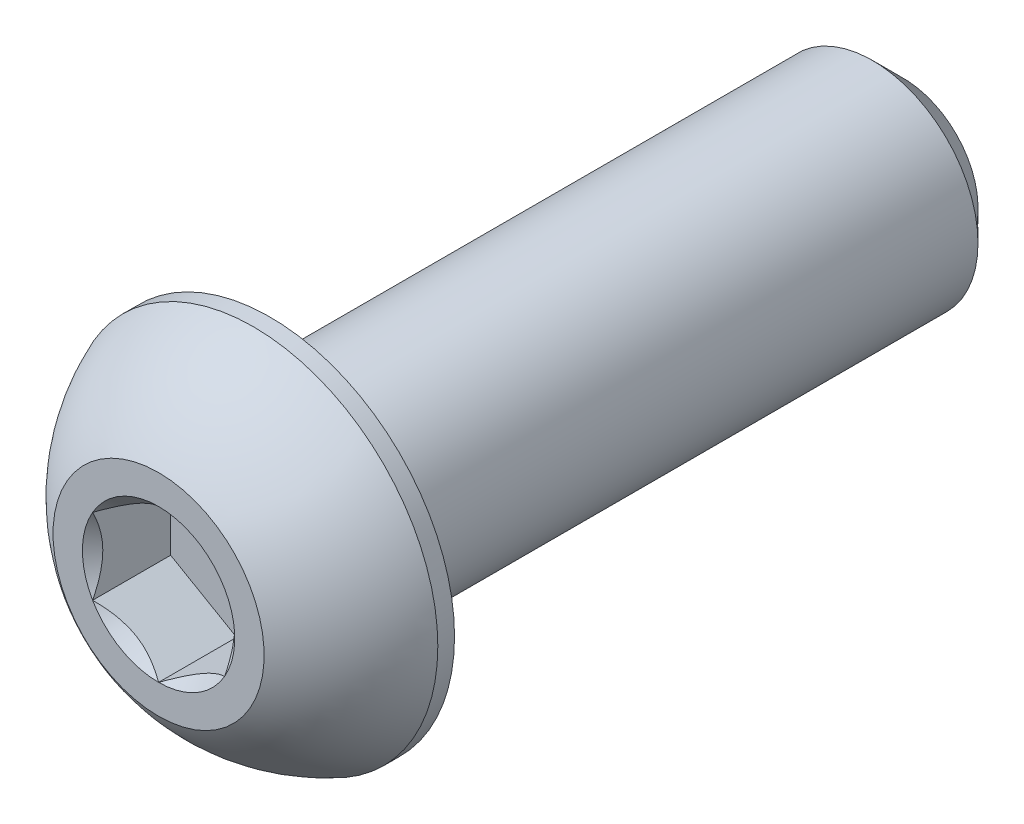
ISO-10303-21;
HEADER;
FILE_DESCRIPTION(('STEP AP214'),'2;1');
FILE_NAME('part.step','',(''),(''),'','','');
FILE_SCHEMA(('AUTOMOTIVE_DESIGN { 1 0 10303 214 1 1 1 1 }'));
ENDSEC;
DATA;
#1=APPLICATION_CONTEXT('core data for automotive mechanical design processes');
#2=APPLICATION_PROTOCOL_DEFINITION('international standard','automotive_design',2000,#1);
#3=PRODUCT_CONTEXT('',#1,'mechanical');
#4=PRODUCT('Part','Part','',(#3));
#5=PRODUCT_RELATED_PRODUCT_CATEGORY('part','',(#4));
#6=PRODUCT_DEFINITION_FORMATION('','',#4);
#7=PRODUCT_DEFINITION_CONTEXT('part definition',#1,'design');
#8=PRODUCT_DEFINITION('design','',#6,#7);
#9=PRODUCT_DEFINITION_SHAPE('','',#8);
#10=(LENGTH_UNIT() NAMED_UNIT(*) SI_UNIT(.MILLI.,.METRE.));
#11=(NAMED_UNIT(*) PLANE_ANGLE_UNIT() SI_UNIT($,.RADIAN.));
#12=(NAMED_UNIT(*) SI_UNIT($,.STERADIAN.) SOLID_ANGLE_UNIT());
#13=UNCERTAINTY_MEASURE_WITH_UNIT(LENGTH_MEASURE(1.E-05),#10,'distance_accuracy_value','');
#14=(GEOMETRIC_REPRESENTATION_CONTEXT(3) GLOBAL_UNCERTAINTY_ASSIGNED_CONTEXT((#13)) GLOBAL_UNIT_ASSIGNED_CONTEXT((#10,
#11,#12)) REPRESENTATION_CONTEXT('',''));
#15=CARTESIAN_POINT('',(0.,0.,0.));
#16=DIRECTION('',(0.,0.,1.));
#17=DIRECTION('',(1.,0.,0.));
#18=AXIS2_PLACEMENT_3D('',#15,#16,#17);
#19=CARTESIAN_POINT('',(0.,-3.17500000000001,-22.4028));
#20=DIRECTION('',(0.,0.,-1.));
#21=DIRECTION('',(0.,1.,0.));
#22=AXIS2_PLACEMENT_3D('',#19,#20,#21);
#23=PLANE('',#22);
#24=CARTESIAN_POINT('',(0.,0.,-22.4028));
#25=DIRECTION('',(0.,0.,-1.));
#26=DIRECTION('',(0.,1.,0.));
#27=AXIS2_PLACEMENT_3D('',#24,#25,#26);
#28=CIRCLE('',#27,2.24573170731707);
#29=CARTESIAN_POINT('',(0.,-2.24573170731708,-22.4028));
#30=VERTEX_POINT('',#29);
#31=EDGE_CURVE('E181',#30,#30,#28,.T.);
#32=ORIENTED_EDGE('',*,*,#31,.T.);
#33=EDGE_LOOP('',(#32));
#34=FACE_BOUND('',#33,.T.);
#35=ADVANCED_FACE('F41',(#34),#23,.T.);
#36=CARTESIAN_POINT('',(0.,0.,-22.4028));
#37=DIRECTION('',(0.,0.,-1.));
#38=DIRECTION('',(0.,1.,0.));
#39=AXIS2_PLACEMENT_3D('',#36,#37,#38);
#40=CYLINDRICAL_SURFACE('',#39,3.175);
#41=CARTESIAN_POINT('',(0.,0.,-21.4735317073171));
#42=DIRECTION('',(0.,0.,-1.));
#43=DIRECTION('',(0.,1.,0.));
#44=AXIS2_PLACEMENT_3D('',#41,#42,#43);
#45=CIRCLE('',#44,3.175);
#46=CARTESIAN_POINT('',(0.,-3.17500000000001,-21.4735317073171));
#47=VERTEX_POINT('',#46);
#48=EDGE_CURVE('E55',#47,#47,#45,.F.);
#49=ORIENTED_EDGE('',*,*,#48,.T.);
#50=EDGE_LOOP('',(#49));
#51=FACE_BOUND('',#50,.T.);
#52=CARTESIAN_POINT('',(0.,0.,-3.3528));
#53=DIRECTION('',(0.,0.,1.));
#54=DIRECTION('',(1.,0.,0.));
#55=AXIS2_PLACEMENT_3D('',#52,#53,#54);
#56=CIRCLE('',#55,3.175);
#57=CARTESIAN_POINT('',(3.175,0.,-3.3528));
#58=VERTEX_POINT('',#57);
#59=EDGE_CURVE('E178',#58,#58,#56,.F.);
#60=ORIENTED_EDGE('',*,*,#59,.T.);
#61=EDGE_LOOP('',(#60));
#62=FACE_BOUND('',#61,.T.);
#63=ADVANCED_FACE('F186',(#51,#62),#40,.T.);
#64=CARTESIAN_POINT('',(0.,0.,-22.4028));
#65=DIRECTION('',(0.,0.,1.));
#66=DIRECTION('',(0.,-1.,0.));
#67=AXIS2_PLACEMENT_3D('',#64,#65,#66);
#68=CONICAL_SURFACE('',#67,2.24573170731707,0.78539816339745);
#69=CARTESIAN_POINT('',(0.,-3.17500000000001,-21.4735317073171));
#70=CARTESIAN_POINT('',(0.,-3.16532012195123,-21.4832115853659));
#71=CARTESIAN_POINT('',(0.,-3.15564024390245,-21.4928914634146));
#72=CARTESIAN_POINT('',(0.,-3.13628048780489,-21.5122512195122));
#73=CARTESIAN_POINT('',(0.,-3.1266006097561,-21.521931097561));
#74=CARTESIAN_POINT('',(0.,-3.10724085365854,-21.5412908536585));
#75=CARTESIAN_POINT('',(0.,-3.09756097560976,-21.5509707317073));
#76=CARTESIAN_POINT('',(0.,-3.0782012195122,-21.5703304878049));
#77=CARTESIAN_POINT('',(0.,-3.06852134146342,-21.5800103658537));
#78=CARTESIAN_POINT('',(0.,-3.04916158536586,-21.5993701219512));
#79=CARTESIAN_POINT('',(0.,-3.03948170731708,-21.60905));
#80=CARTESIAN_POINT('',(0.,-3.02012195121952,-21.6284097560976));
#81=CARTESIAN_POINT('',(0.,-3.01044207317074,-21.6380896341463));
#82=CARTESIAN_POINT('',(0.,-2.99108231707318,-21.6574493902439));
#83=CARTESIAN_POINT('',(0.,-2.9814024390244,-21.6671292682927));
#84=CARTESIAN_POINT('',(0.,-2.96204268292684,-21.6864890243902));
#85=CARTESIAN_POINT('',(0.,-2.95236280487806,-21.696168902439));
#86=CARTESIAN_POINT('',(0.,-2.93300304878049,-21.7155286585366));
#87=CARTESIAN_POINT('',(0.,-2.92332317073171,-21.7252085365854));
#88=CARTESIAN_POINT('',(0.,-2.90396341463415,-21.7445682926829));
#89=CARTESIAN_POINT('',(0.,-2.89428353658537,-21.7542481707317));
#90=CARTESIAN_POINT('',(0.,-2.87492378048781,-21.7736079268293));
#91=CARTESIAN_POINT('',(0.,-2.86524390243903,-21.783287804878));
#92=CARTESIAN_POINT('',(0.,-2.84588414634147,-21.8026475609756));
#93=CARTESIAN_POINT('',(0.,-2.83620426829269,-21.8123274390244));
#94=CARTESIAN_POINT('',(0.,-2.81684451219513,-21.831687195122));
#95=CARTESIAN_POINT('',(0.,-2.80716463414635,-21.8413670731707));
#96=CARTESIAN_POINT('',(0.,-2.78780487804879,-21.8607268292683));
#97=CARTESIAN_POINT('',(0.,-2.77812500000001,-21.8704067073171));
#98=CARTESIAN_POINT('',(0.,-2.75876524390245,-21.8897664634146));
#99=CARTESIAN_POINT('',(0.,-2.74908536585366,-21.8994463414634));
#100=CARTESIAN_POINT('',(0.,-2.7297256097561,-21.918806097561));
#101=CARTESIAN_POINT('',(0.,-2.72004573170732,-21.9284859756098));
#102=CARTESIAN_POINT('',(0.,-2.70068597560976,-21.9478457317073));
#103=CARTESIAN_POINT('',(0.,-2.69100609756098,-21.9575256097561));
#104=CARTESIAN_POINT('',(0.,-2.67164634146342,-21.9768853658537));
#105=CARTESIAN_POINT('',(0.,-2.66196646341464,-21.9865652439024));
#106=CARTESIAN_POINT('',(0.,-2.64260670731708,-22.005925));
#107=CARTESIAN_POINT('',(0.,-2.6329268292683,-22.0156048780488));
#108=CARTESIAN_POINT('',(0.,-2.61356707317074,-22.0349646341463));
#109=CARTESIAN_POINT('',(0.,-2.60388719512196,-22.0446445121951));
#110=CARTESIAN_POINT('',(0.,-2.5845274390244,-22.0640042682927));
#111=CARTESIAN_POINT('',(0.,-2.57484756097562,-22.0736841463415));
#112=CARTESIAN_POINT('',(0.,-2.55548780487805,-22.093043902439));
#113=CARTESIAN_POINT('',(0.,-2.54580792682927,-22.1027237804878));
#114=CARTESIAN_POINT('',(0.,-2.52644817073171,-22.1220835365854));
#115=CARTESIAN_POINT('',(0.,-2.51676829268293,-22.1317634146341));
#116=CARTESIAN_POINT('',(0.,-2.49740853658537,-22.1511231707317));
#117=CARTESIAN_POINT('',(0.,-2.48772865853659,-22.1608030487805));
#118=CARTESIAN_POINT('',(0.,-2.46836890243903,-22.180162804878));
#119=CARTESIAN_POINT('',(0.,-2.45868902439025,-22.1898426829268));
#120=CARTESIAN_POINT('',(0.,-2.43932926829269,-22.2092024390244));
#121=CARTESIAN_POINT('',(0.,-2.42964939024391,-22.2188823170732));
#122=CARTESIAN_POINT('',(0.,-2.41028963414635,-22.2382420731707));
#123=CARTESIAN_POINT('',(0.,-2.40060975609757,-22.2479219512195));
#124=CARTESIAN_POINT('',(0.,-2.38125000000001,-22.2672817073171));
#125=CARTESIAN_POINT('',(0.,-2.37157012195123,-22.2769615853659));
#126=CARTESIAN_POINT('',(0.,-2.35221036585366,-22.2963213414634));
#127=CARTESIAN_POINT('',(0.,-2.34253048780488,-22.3060012195122));
#128=CARTESIAN_POINT('',(0.,-2.32317073170732,-22.3253609756098));
#129=CARTESIAN_POINT('',(0.,-2.31349085365854,-22.3350408536585));
#130=CARTESIAN_POINT('',(0.,-2.29413109756098,-22.3544006097561));
#131=CARTESIAN_POINT('',(0.,-2.2844512195122,-22.3640804878049));
#132=CARTESIAN_POINT('',(0.,-2.26509146341464,-22.3834402439024));
#133=CARTESIAN_POINT('',(0.,-2.25541158536586,-22.3931201219512));
#134=CARTESIAN_POINT('',(0.,-2.24573170731708,-22.4028));
#135=B_SPLINE_CURVE_WITH_KNOTS('',3,(#69,#70,#71,#72,#73,#74,#75,#76,#77,#78,#79,#80,#81,#82,
#83,#84,#85,#86,#87,#88,#89,#90,#91,#92,#93,#94,#95,#96,#97,#98,#99,#100,#101,#102,#103,#104,
#105,#106,#107,#108,#109,#110,#111,#112,#113,#114,#115,#116,#117,#118,#119,#120,#121,#122,#123,
#124,#125,#126,#127,#128,#129,#130,#131,#132,#133,#134),.UNSPECIFIED.,.F.,.F.,(4,2,2,2,2,2,2,2,
2,2,2,2,2,2,2,2,2,2,2,2,2,2,2,2,2,2,2,2,2,2,2,2,4),(0.,0.0410682444561088,0.0821364889122173,
0.123204733368326,0.164272977824435,0.205341222280544,0.246409466736652,0.287477711192761,
0.32854595564887,0.369614200104979,0.410682444561088,0.451750689017199,0.492818933473308,
0.533887177929416,0.574955422385525,0.616023666841634,0.657091911297742,0.698160155753851,
0.73922840020996,0.780296644666069,0.821364889122178,0.862433133578286,0.903501378034398,
0.944569622490506,0.985637866946615,1.02670611140272,1.06777435585883,1.10884260031494,
1.14991084477105,1.19097908922716,1.23204733368327,1.27311557813938,1.31418382259549),.UNSPECIFIED.);
#136=EDGE_CURVE('BSEAM43',#47,#30,#135,.T.);
#137=ORIENTED_EDGE('',*,*,#48,.F.);
#138=ORIENTED_EDGE('',*,*,#31,.F.);
#139=ORIENTED_EDGE('',*,*,#136,.T.);
#140=ORIENTED_EDGE('',*,*,#136,.F.);
#141=EDGE_LOOP('',(#137,#139,#138,#140));
#142=FACE_BOUND('',#141,.T.);
#143=ADVANCED_FACE('F43',(#142),#68,.T.);
#144=CARTESIAN_POINT('',(0.,0.,-5.060315));
#145=DIRECTION('',(0.,0.,1.));
#146=DIRECTION('',(0.,-1.,0.));
#147=AXIS2_PLACEMENT_3D('',#144,#145,#146);
#148=SPHERICAL_SURFACE('',#147,5.97389428256184);
#149=CARTESIAN_POINT('',(0.,0.,0.));
#150=DIRECTION('',(0.,0.,1.));
#151=DIRECTION('',(1.,0.,0.));
#152=AXIS2_PLACEMENT_3D('',#149,#150,#151);
#153=CIRCLE('',#152,3.175);
#154=CARTESIAN_POINT('',(0.,-3.175,0.));
#155=VERTEX_POINT('',#154);
#156=EDGE_CURVE('E175',#155,#155,#153,.T.);
#157=CARTESIAN_POINT('',(0.,0.,-2.84988));
#158=DIRECTION('',(0.,0.,1.));
#159=DIRECTION('',(1.,0.,0.));
#160=AXIS2_PLACEMENT_3D('',#157,#158,#159);
#161=CIRCLE('',#160,5.5499);
#162=CARTESIAN_POINT('',(0.,-5.5499,-2.84988));
#163=VERTEX_POINT('',#162);
#164=EDGE_CURVE('E169',#163,#163,#161,.T.);
#165=CARTESIAN_POINT('',(0.,-3.175,0.));
#166=CARTESIAN_POINT('',(0.,-3.20828343957184,-0.020883007658051));
#167=CARTESIAN_POINT('',(0.,-3.24136078860705,-0.0420944789280512));
#168=CARTESIAN_POINT('',(0.,-3.30709055775141,-0.0851658910984726));
#169=CARTESIAN_POINT('',(0.,-3.33974297786056,-0.107025831998894));
#170=CARTESIAN_POINT('',(0.,-3.40461014130008,-0.151385725836677));
#171=CARTESIAN_POINT('',(0.,-3.43682488463043,-0.173885678774039));
#172=CARTESIAN_POINT('',(0.,-3.50080416139461,-0.21951682225948));
#173=CARTESIAN_POINT('',(0.,-3.53256869482844,-0.242648012807558));
#174=CARTESIAN_POINT('',(0.,-3.59563518208834,-0.289532629449103));
#175=CARTESIAN_POINT('',(0.,-3.62693713591442,-0.313286055542569));
#176=CARTESIAN_POINT('',(0.,-3.68906627753106,-0.361405894091331));
#177=CARTESIAN_POINT('',(0.,-3.71989346532163,-0.385772306546627));
#178=CARTESIAN_POINT('',(0.,-3.78106107243204,-0.435108631276878));
#179=CARTESIAN_POINT('',(0.,-3.8114014917519,-0.460078543551834));
#180=CARTESIAN_POINT('',(0.,-3.87158374923259,-0.510612146063938));
#181=CARTESIAN_POINT('',(0.,-3.90142558739343,-0.536175836301087));
#182=CARTESIAN_POINT('',(0.,-3.96059906392414,-0.587887041792084));
#183=CARTESIAN_POINT('',(0.,-3.989930702294,-0.614034557045932));
#184=CARTESIAN_POINT('',(0.,-4.04807235926832,-0.666903232293408));
#185=CARTESIAN_POINT('',(0.,-4.07688237787279,-0.693624392287035));
#186=CARTESIAN_POINT('',(0.,-4.13396957842491,-0.747629953401058));
#187=CARTESIAN_POINT('',(0.,-4.16224676037256,-0.774914354521453));
#188=CARTESIAN_POINT('',(0.,-4.21825727817542,-0.830035774981947));
#189=CARTESIAN_POINT('',(0.,-4.24599061403061,-0.857872794322044));
#190=CARTESIAN_POINT('',(0.,-4.30090264195357,-0.914088613159021));
#191=CARTESIAN_POINT('',(0.,-4.32808133402134,-0.942467412655899));
#192=CARTESIAN_POINT('',(0.,-4.38187349261953,-0.999755742806741));
#193=CARTESIAN_POINT('',(0.,-4.40848695914995,-1.0286652734607));
#194=CARTESIAN_POINT('',(0.,-4.46113830498838,-1.08700381029123));
#195=CARTESIAN_POINT('',(0.,-4.48717618429639,-1.11643281646778));
#196=CARTESIAN_POINT('',(0.,-4.53866621810402,-1.17579884645643));
#197=CARTESIAN_POINT('',(0.,-4.56411837260364,-1.20573587026853));
#198=CARTESIAN_POINT('',(0.,-4.61442704725457,-1.26610627984964));
#199=CARTESIAN_POINT('',(0.,-4.63928356740587,-1.29653966561866));
#200=CARTESIAN_POINT('',(0.,-4.68839129572448,-1.3578909501815));
#201=CARTESIAN_POINT('',(0.,-4.71264250389178,-1.38880884897531));
#202=CARTESIAN_POINT('',(0.,-4.76053016627881,-1.45111712201534));
#203=CARTESIAN_POINT('',(0.,-4.78416662049853,-1.48250749626155));
#204=CARTESIAN_POINT('',(0.,-4.8308155723751,-1.54574849868041));
#205=CARTESIAN_POINT('',(0.,-4.85382807003194,-1.57759912685306));
#206=CARTESIAN_POINT('',(0.,-4.89922014909859,-1.64174823640362));
#207=CARTESIAN_POINT('',(0.,-4.92159973050841,-1.67404671778154));
#208=CARTESIAN_POINT('',(0.,-4.96571726381658,-1.73907895865427));
#209=CARTESIAN_POINT('',(0.,-4.98745521571493,-1.77181271814908));
#210=CARTESIAN_POINT('',(0.,-5.03028102654719,-1.83770277069632));
#211=CARTESIAN_POINT('',(0.,-5.0513688854811,-1.87085906374874));
#212=CARTESIAN_POINT('',(0.,-5.09288630004063,-1.93758127434189));
#213=CARTESIAN_POINT('',(0.,-5.11331585566624,-1.97114719188261));
#214=CARTESIAN_POINT('',(0.,-5.15350870956168,-2.03867558290299));
#215=CARTESIAN_POINT('',(0.,-5.17327200783151,-2.07263805638265));
#216=CARTESIAN_POINT('',(0.,-5.21212465239608,-2.14094633632486));
#217=CARTESIAN_POINT('',(0.,-5.23121399869082,-2.17529214278741));
#218=CARTESIAN_POINT('',(0.,-5.26871130697935,-2.2443537165359));
#219=CARTESIAN_POINT('',(0.,-5.28711926897315,-2.27906948382184));
#220=CARTESIAN_POINT('',(0.,-5.32324664200827,-2.3488574628552));
#221=CARTESIAN_POINT('',(0.,-5.3409660530496,-2.38392967460262));
#222=CARTESIAN_POINT('',(0.,-5.37570942417474,-2.45441688802313));
#223=CARTESIAN_POINT('',(0.,-5.39273338425856,-2.48983188969622));
#224=CARTESIAN_POINT('',(0.,-5.42607922958184,-2.56099089271574));
#225=CARTESIAN_POINT('',(0.,-5.44240111482132,-2.59673489406217));
#226=CARTESIAN_POINT('',(0.,-5.47433643994316,-2.66853798649801));
#227=CARTESIAN_POINT('',(0.,-5.48994987982553,-2.70459707758742));
#228=CARTESIAN_POINT('',(0.,-5.52046229408188,-2.77701628549785));
#229=CARTESIAN_POINT('',(0.,-5.53536126845586,-2.81337640231887));
#230=CARTESIAN_POINT('',(0.,-5.5499,-2.84988));
#231=B_SPLINE_CURVE_WITH_KNOTS('',3,(#165,#166,#167,#168,#169,#170,#171,#172,#173,#174,#175,
#176,#177,#178,#179,#180,#181,#182,#183,#184,#185,#186,#187,#188,#189,#190,#191,#192,#193,#194,
#195,#196,#197,#198,#199,#200,#201,#202,#203,#204,#205,#206,#207,#208,#209,#210,#211,#212,#213,
#214,#215,#216,#217,#218,#219,#220,#221,#222,#223,#224,#225,#226,#227,#228,#229,#230),
.UNSPECIFIED.,.F.,.F.,(4,2,2,2,2,2,2,2,2,2,2,2,2,2,2,2,2,2,2,2,2,2,2,2,2,2,2,2,2,2,2,2,4),(0.,
0.1178750807537,0.235750161507399,0.353625242261099,0.471500323014798,0.589375403768498,
0.707250484522197,0.825125565275897,0.943000646029597,1.0608757267833,1.17875080753699,
1.29662588829069,1.41450096904439,1.53237604979809,1.65025113055179,1.76812621130549,
1.88600129205919,2.00387637281289,2.12175145356659,2.23962653432029,2.35750161507399,
2.47537669582769,2.59325177658139,2.71112685733509,2.82900193808879,2.94687701884249,
3.06475209959619,3.18262718034989,3.30050226110359,3.41837734185729,3.53625242261099,
3.65412750336468,3.77200258411838),.UNSPECIFIED.);
#232=EDGE_CURVE('BSEAM191',#155,#163,#231,.T.);
#233=ORIENTED_EDGE('',*,*,#156,.F.);
#234=ORIENTED_EDGE('',*,*,#164,.T.);
#235=ORIENTED_EDGE('',*,*,#232,.T.);
#236=ORIENTED_EDGE('',*,*,#232,.F.);
#237=EDGE_LOOP('',(#233,#235,#234,#236));
#238=FACE_BOUND('',#237,.T.);
#239=ADVANCED_FACE('F191',(#238),#148,.T.);
#240=CARTESIAN_POINT('',(0.,-3.175,0.));
#241=DIRECTION('',(0.,0.,-1.));
#242=DIRECTION('',(-1.,0.,0.));
#243=AXIS2_PLACEMENT_3D('',#240,#241,#242);
#244=PLANE('',#243);
#245=CARTESIAN_POINT('',(0.,0.,0.));
#246=DIRECTION('',(0.,0.,1.));
#247=DIRECTION('',(1.,0.,0.));
#248=AXIS2_PLACEMENT_3D('',#245,#246,#247);
#249=CIRCLE('',#248,2.29135888084633);
#250=CARTESIAN_POINT('',(-1.984375,1.14567944042316,0.));
#251=VERTEX_POINT('',#250);
#252=CARTESIAN_POINT('',(-1.984375,-1.14567944042316,0.));
#253=VERTEX_POINT('',#252);
#254=EDGE_CURVE('E68',#251,#253,#249,.T.);
#255=ORIENTED_EDGE('',*,*,#254,.F.);
#256=CARTESIAN_POINT('',(0.,2.29135888084633,0.));
#257=VERTEX_POINT('',#256);
#258=EDGE_CURVE('E140',#257,#251,#249,.T.);
#259=ORIENTED_EDGE('',*,*,#258,.F.);
#260=CARTESIAN_POINT('',(1.984375,1.14567944042316,0.));
#261=VERTEX_POINT('',#260);
#262=EDGE_CURVE('E137',#261,#257,#249,.T.);
#263=ORIENTED_EDGE('',*,*,#262,.F.);
#264=CARTESIAN_POINT('',(1.984375,-1.14567944042316,0.));
#265=VERTEX_POINT('',#264);
#266=EDGE_CURVE('E108',#265,#261,#249,.T.);
#267=ORIENTED_EDGE('',*,*,#266,.F.);
#268=CARTESIAN_POINT('',(0.,-2.29135888084633,0.));
#269=VERTEX_POINT('',#268);
#270=EDGE_CURVE('E100',#269,#265,#249,.T.);
#271=ORIENTED_EDGE('',*,*,#270,.F.);
#272=EDGE_CURVE('E61',#253,#269,#249,.T.);
#273=ORIENTED_EDGE('',*,*,#272,.F.);
#274=EDGE_LOOP('',(#255,#259,#263,#267,#271,#273));
#275=FACE_BOUND('',#274,.T.);
#276=ORIENTED_EDGE('',*,*,#156,.T.);
#277=EDGE_LOOP('',(#276));
#278=FACE_BOUND('',#277,.T.);
#279=ADVANCED_FACE('F134',(#275,#278),#244,.F.);
#280=CARTESIAN_POINT('',(0.,-5.5499,-3.3528));
#281=DIRECTION('',(0.,0.,1.));
#282=DIRECTION('',(1.,0.,0.));
#283=AXIS2_PLACEMENT_3D('',#280,#281,#282);
#284=PLANE('',#283);
#285=ORIENTED_EDGE('',*,*,#59,.F.);
#286=EDGE_LOOP('',(#285));
#287=FACE_BOUND('',#286,.T.);
#288=CARTESIAN_POINT('',(0.,0.,-3.3528));
#289=DIRECTION('',(0.,0.,1.));
#290=DIRECTION('',(1.,0.,0.));
#291=AXIS2_PLACEMENT_3D('',#288,#289,#290);
#292=CIRCLE('',#291,5.5499);
#293=CARTESIAN_POINT('',(5.5499,0.,-3.3528));
#294=VERTEX_POINT('',#293);
#295=EDGE_CURVE('E172',#294,#294,#292,.T.);
#296=ORIENTED_EDGE('',*,*,#295,.F.);
#297=EDGE_LOOP('',(#296));
#298=FACE_BOUND('',#297,.T.);
#299=ADVANCED_FACE('F205',(#287,#298),#284,.F.);
#300=CARTESIAN_POINT('',(0.,0.,0.));
#301=DIRECTION('',(0.,0.,1.));
#302=DIRECTION('',(1.,0.,0.));
#303=AXIS2_PLACEMENT_3D('',#300,#301,#302);
#304=CYLINDRICAL_SURFACE('',#303,5.5499);
#305=ORIENTED_EDGE('',*,*,#164,.F.);
#306=EDGE_LOOP('',(#305));
#307=FACE_BOUND('',#306,.T.);
#308=ORIENTED_EDGE('',*,*,#295,.T.);
#309=EDGE_LOOP('',(#308));
#310=FACE_BOUND('',#309,.T.);
#311=ADVANCED_FACE('F208',(#307,#310),#304,.T.);
#312=CARTESIAN_POINT('',(0.,0.,0.));
#313=DIRECTION('',(0.,0.,1.));
#314=DIRECTION('',(1.,0.,0.));
#315=AXIS2_PLACEMENT_3D('',#312,#313,#314);
#316=CONICAL_SURFACE('',#315,2.29135888084633,0.78539816339745);
#317=ORIENTED_EDGE('',*,*,#266,.T.);
#318=CARTESIAN_POINT('',(1.984375,-2.28495242157822,0.734984078816568));
#319=CARTESIAN_POINT('',(1.984375,-2.22931635455402,0.692986685550761));
#320=CARTESIAN_POINT('',(1.984375,-2.17336876548389,0.651396054076336));
#321=CARTESIAN_POINT('',(1.984375,-2.06072770258171,0.569208461471479));
#322=CARTESIAN_POINT('',(1.984375,-2.00403404503435,0.528611752405042));
#323=CARTESIAN_POINT('',(1.984375,-1.88936329173488,0.448303503174669));
#324=CARTESIAN_POINT('',(1.984375,-1.83137965519348,0.408601258813307));
#325=CARTESIAN_POINT('',(1.984375,-1.7144280213784,0.330685173401292));
#326=CARTESIAN_POINT('',(1.984375,-1.65546009407228,0.292471227194368));
#327=CARTESIAN_POINT('',(1.984375,-1.47005472306035,0.176252834013636));
#328=CARTESIAN_POINT('',(1.984375,-1.34163909427883,0.101347886872381));
#329=CARTESIAN_POINT('',(1.984375,-1.0784038470548,-0.0356697845602626));
#330=CARTESIAN_POINT('',(1.984375,-0.943607781407425,-0.0978256335176257));
#331=CARTESIAN_POINT('',(1.984375,-0.741275100444882,-0.173867421311381));
#332=CARTESIAN_POINT('',(1.984375,-0.676735408881095,-0.195691938673995));
#333=CARTESIAN_POINT('',(1.984375,-0.546098118112762,-0.234159536462205));
#334=CARTESIAN_POINT('',(1.984375,-0.480000411919956,-0.250802259934452));
#335=CARTESIAN_POINT('',(1.984375,-0.347746170028532,-0.277764619130277));
#336=CARTESIAN_POINT('',(1.984375,-0.281612071479123,-0.288192590264108));
#337=CARTESIAN_POINT('',(1.984375,-0.14863662005235,-0.302521852623404));
#338=CARTESIAN_POINT('',(1.984375,-0.0817953907393235,-0.306424265772614));
#339=CARTESIAN_POINT('',(1.984375,0.0495156750890646,-0.307412948667328));
#340=CARTESIAN_POINT('',(1.984375,0.113983775102992,-0.304740821124985));
#341=CARTESIAN_POINT('',(1.984375,0.242367515846177,-0.293260789502485));
#342=CARTESIAN_POINT('',(1.984375,0.30628310229592,-0.284452289360786));
#343=CARTESIAN_POINT('',(1.984375,0.434181040262184,-0.261030978667103));
#344=CARTESIAN_POINT('',(1.984375,0.498145026858309,-0.246319393767914));
#345=CARTESIAN_POINT('',(1.984375,0.624675616953007,-0.211873818587874));
#346=CARTESIAN_POINT('',(1.984375,0.687242336899689,-0.192140248550805));
#347=CARTESIAN_POINT('',(1.984375,0.884225483826087,-0.12258776276924));
#348=CARTESIAN_POINT('',(1.984375,1.01583674256468,-0.0648475887435035));
#349=CARTESIAN_POINT('',(1.984375,1.27288659242652,0.0635303365887973));
#350=CARTESIAN_POINT('',(1.984375,1.3983008827048,0.134214424919412));
#351=CARTESIAN_POINT('',(1.984375,1.57956687990221,0.244516663813198));
#352=CARTESIAN_POINT('',(1.984375,1.63738271299424,0.280969829475363));
#353=CARTESIAN_POINT('',(1.984375,1.75202215386201,0.355415963291704));
#354=CARTESIAN_POINT('',(1.984375,1.80884568601361,0.393409048078053));
#355=CARTESIAN_POINT('',(1.984375,1.92116923084255,0.470338808893089));
#356=CARTESIAN_POINT('',(1.984375,1.97667624512253,0.50926531303879));
#357=CARTESIAN_POINT('',(1.984375,2.08693170717166,0.588147746121385));
#358=CARTESIAN_POINT('',(1.984375,2.14168035934792,0.628103389024029));
#359=CARTESIAN_POINT('',(1.984375,2.19611149046622,0.668480611285425));
#360=B_SPLINE_CURVE_WITH_KNOTS('',3,(#318,#319,#320,#321,#322,#323,#324,#325,#326,#327,#328,
#329,#330,#331,#332,#333,#334,#335,#336,#337,#338,#339,#340,#341,#342,#343,#344,#345,#346,#347,
#348,#349,#350,#351,#352,#353,#354,#355,#356,#357,#358,#359),.UNSPECIFIED.,.F.,.F.,(4,2,2,2,2,2,
2,2,2,2,2,2,2,2,2,2,2,2,2,2,4),(0.,0.209126070008322,0.418304637356569,0.629103979977992,
0.839888401371185,1.28549951116127,1.72957750768351,1.93379389749971,2.13802435186698,
2.33858179514334,2.53910475350639,2.73236963400794,2.92565329006887,3.12231577097487,
3.31896180041345,3.74886295245172,4.18033428125362,4.3853601718029,4.59040161996382,
4.79377749165107,4.99709743524131),.UNSPECIFIED.);
#361=EDGE_CURVE('E11',#265,#261,#360,.T.);
#362=ORIENTED_EDGE('',*,*,#361,.F.);
#363=EDGE_LOOP('',(#317,#362));
#364=FACE_BOUND('',#363,.T.);
#365=ADVANCED_FACE('F112',(#364),#316,.F.);
#366=ORIENTED_EDGE('',*,*,#262,.T.);
#367=CARTESIAN_POINT('',(1.984575,1.14556397036933,0.000115478781843379));
#368=CARTESIAN_POINT('',(1.9163590048332,1.18494849354192,-0.0392371477360852));
#369=CARTESIAN_POINT('',(1.84700231489303,1.22499159714897,-0.0762786895538154));
#370=CARTESIAN_POINT('',(1.70557619954781,1.30664400291398,-0.144101141576677));
#371=CARTESIAN_POINT('',(1.63349332126322,1.34826107209555,-0.174844310908246));
#372=CARTESIAN_POINT('',(1.488141602734,1.43217992591557,-0.227508111188786));
#373=CARTESIAN_POINT('',(1.41490978751306,1.47446033414663,-0.249561124120036));
#374=CARTESIAN_POINT('',(1.26683381740529,1.55995203534886,-0.283538507056124));
#375=CARTESIAN_POINT('',(1.19199418724658,1.60316071596705,-0.295488243908272));
#376=CARTESIAN_POINT('',(1.06301458545618,1.6776271237807,-0.306269900918094));
#377=CARTESIAN_POINT('',(1.00904128422756,1.7087886237741,-0.30786610094093));
#378=CARTESIAN_POINT('',(0.901182881480199,1.77106070163465,-0.305178161134708));
#379=CARTESIAN_POINT('',(0.847297817514476,1.80217125782056,-0.300891959659541));
#380=CARTESIAN_POINT('',(0.740036461751395,1.86409863044402,-0.286683126986481));
#381=CARTESIAN_POINT('',(0.686660807239859,1.89491507894443,-0.276754189547727));
#382=CARTESIAN_POINT('',(0.580832482591103,1.95601509066828,-0.251804915725461));
#383=CARTESIAN_POINT('',(0.528379742028898,1.9862986945516,-0.236784969610512));
#384=CARTESIAN_POINT('',(0.394017661036351,2.06387267818152,-0.19219214836433));
#385=CARTESIAN_POINT('',(0.312941642841675,2.11068193911104,-0.159257004061667));
#386=CARTESIAN_POINT('',(0.19372669327016,2.17951072233758,-0.103657558797803));
#387=CARTESIAN_POINT('',(0.154440075613999,2.20219286161692,-0.0841224079481377));
#388=CARTESIAN_POINT('',(0.0765946381319469,2.24713694590237,-0.0432712618805986));
#389=CARTESIAN_POINT('',(0.0380353888983011,2.26939913882716,-0.0219563604316497));
#390=CARTESIAN_POINT('',(-0.000200000000000015,2.29147435090017,0.000115478781842912));
#391=B_SPLINE_CURVE_WITH_KNOTS('',3,(#367,#368,#369,#370,#371,#372,#373,#374,#375,#376,#377,
#378,#379,#380,#381,#382,#383,#384,#385,#386,#387,#388,#389,#390),.UNSPECIFIED.,.F.,.F.,(4,2,2,
2,2,2,2,2,2,2,2,4),(0.,0.264339630306627,0.530219665093694,0.791876416371461,1.05287424418109,
1.239639843932,1.42647091743852,1.61351120244035,1.8005371524754,2.09764209964316,
2.24579179873714,2.39385111134157),.UNSPECIFIED.);
#392=EDGE_CURVE('E139',#261,#257,#391,.T.);
#393=ORIENTED_EDGE('',*,*,#392,.F.);
#394=EDGE_LOOP('',(#366,#393));
#395=FACE_BOUND('',#394,.T.);
#396=ADVANCED_FACE('F293',(#395),#316,.F.);
#397=ORIENTED_EDGE('',*,*,#258,.T.);
#398=CARTESIAN_POINT('',(0.000199999999999816,2.29147435090017,0.000115478781843248));
#399=CARTESIAN_POINT('',(-0.0680159951668024,2.25208982772757,-0.0392371477360855));
#400=CARTESIAN_POINT('',(-0.137372685106966,2.21204672412052,-0.0762786895538156));
#401=CARTESIAN_POINT('',(-0.278798800452188,2.13039431835551,-0.144101141576677));
#402=CARTESIAN_POINT('',(-0.350881678736783,2.08877724917394,-0.174844310908247));
#403=CARTESIAN_POINT('',(-0.496233397266004,2.00485839535392,-0.227508111188787));
#404=CARTESIAN_POINT('',(-0.569465212486939,1.96257798712287,-0.249561124120037));
#405=CARTESIAN_POINT('',(-0.717541182594707,1.87708628592063,-0.283538507056125));
#406=CARTESIAN_POINT('',(-0.792380812753425,1.83387760530244,-0.295488243908272));
#407=CARTESIAN_POINT('',(-0.921360414543816,1.75941119748879,-0.306269900918094));
#408=CARTESIAN_POINT('',(-0.975333715772443,1.72824969749539,-0.307866100940931));
#409=CARTESIAN_POINT('',(-1.0831921185198,1.66597761963484,-0.305178161134708));
#410=CARTESIAN_POINT('',(-1.13707718248552,1.63486706344893,-0.300891959659542));
#411=CARTESIAN_POINT('',(-1.2443385382486,1.57293969082547,-0.286683126986482));
#412=CARTESIAN_POINT('',(-1.29771419276014,1.54212324232506,-0.276754189547728));
#413=CARTESIAN_POINT('',(-1.4035425174089,1.48102323060122,-0.251804915725462));
#414=CARTESIAN_POINT('',(-1.4559952579711,1.45073962671789,-0.236784969610513));
#415=CARTESIAN_POINT('',(-1.59035733896365,1.37316564308797,-0.192192148364331));
#416=CARTESIAN_POINT('',(-1.67143335715832,1.32635638215845,-0.159257004061668));
#417=CARTESIAN_POINT('',(-1.79064830672984,1.25752759893191,-0.103657558797804));
#418=CARTESIAN_POINT('',(-1.829934924386,1.23484545965257,-0.0841224079481383));
#419=CARTESIAN_POINT('',(-1.90778036186805,1.18990137536712,-0.0432712618805989));
#420=CARTESIAN_POINT('',(-1.9463396111017,1.16763918244233,-0.0219563604316499));
#421=CARTESIAN_POINT('',(-1.984575,1.14556397036932,0.000115478781842648));
#422=B_SPLINE_CURVE_WITH_KNOTS('',3,(#398,#399,#400,#401,#402,#403,#404,#405,#406,#407,#408,
#409,#410,#411,#412,#413,#414,#415,#416,#417,#418,#419,#420,#421),.UNSPECIFIED.,.F.,.F.,(4,2,2,
2,2,2,2,2,2,2,2,4),(0.,0.264339630306627,0.530219665093695,0.791876416371461,1.05287424418109,
1.239639843932,1.42647091743852,1.61351120244035,1.8005371524754,2.09764209964316,
2.24579179873714,2.39385111134157),.UNSPECIFIED.);
#423=EDGE_CURVE('E144',#257,#251,#422,.T.);
#424=ORIENTED_EDGE('',*,*,#423,.F.);
#425=EDGE_LOOP('',(#397,#424));
#426=FACE_BOUND('',#425,.T.);
#427=ADVANCED_FACE('F147',(#426),#316,.F.);
#428=ORIENTED_EDGE('',*,*,#254,.T.);
#429=CARTESIAN_POINT('',(-1.984375,-2.28495242157822,0.734984078816568));
#430=CARTESIAN_POINT('',(-1.984375,-2.22931635455402,0.692986685550762));
#431=CARTESIAN_POINT('',(-1.984375,-2.17336876548389,0.651396054076336));
#432=CARTESIAN_POINT('',(-1.984375,-2.06072770258171,0.569208461471479));
#433=CARTESIAN_POINT('',(-1.984375,-2.00403404503435,0.528611752405042));
#434=CARTESIAN_POINT('',(-1.984375,-1.88936329173488,0.448303503174668));
#435=CARTESIAN_POINT('',(-1.984375,-1.83137965519348,0.408601258813307));
#436=CARTESIAN_POINT('',(-1.984375,-1.7144280213784,0.330685173401291));
#437=CARTESIAN_POINT('',(-1.984375,-1.65546009407228,0.292471227194368));
#438=CARTESIAN_POINT('',(-1.984375,-1.47005472306035,0.176252834013636));
#439=CARTESIAN_POINT('',(-1.984375,-1.34163909427883,0.101347886872381));
#440=CARTESIAN_POINT('',(-1.984375,-1.0784038470548,-0.0356697845602626));
#441=CARTESIAN_POINT('',(-1.984375,-0.943607781407424,-0.0978256335176254));
#442=CARTESIAN_POINT('',(-1.984375,-0.741275100444882,-0.173867421311382));
#443=CARTESIAN_POINT('',(-1.984375,-0.676735408881095,-0.195691938673995));
#444=CARTESIAN_POINT('',(-1.984375,-0.546098118112762,-0.234159536462205));
#445=CARTESIAN_POINT('',(-1.984375,-0.480000411919956,-0.250802259934452));
#446=CARTESIAN_POINT('',(-1.984375,-0.347746170028531,-0.277764619130277));
#447=CARTESIAN_POINT('',(-1.984375,-0.281612071479122,-0.288192590264109));
#448=CARTESIAN_POINT('',(-1.984375,-0.14863662005235,-0.302521852623404));
#449=CARTESIAN_POINT('',(-1.984375,-0.0817953907393235,-0.306424265772614));
#450=CARTESIAN_POINT('',(-1.984375,0.0495156750890646,-0.307412948667327));
#451=CARTESIAN_POINT('',(-1.984375,0.113983775102992,-0.304740821124985));
#452=CARTESIAN_POINT('',(-1.984375,0.242367515846177,-0.293260789502485));
#453=CARTESIAN_POINT('',(-1.984375,0.30628310229592,-0.284452289360786));
#454=CARTESIAN_POINT('',(-1.984375,0.434181040262185,-0.261030978667103));
#455=CARTESIAN_POINT('',(-1.984375,0.49814502685831,-0.246319393767914));
#456=CARTESIAN_POINT('',(-1.984375,0.624675616953008,-0.211873818587874));
#457=CARTESIAN_POINT('',(-1.984375,0.687242336899689,-0.192140248550805));
#458=CARTESIAN_POINT('',(-1.984375,0.884225483826087,-0.12258776276924));
#459=CARTESIAN_POINT('',(-1.984375,1.01583674256468,-0.0648475887435035));
#460=CARTESIAN_POINT('',(-1.984375,1.27288659242652,0.0635303365887974));
#461=CARTESIAN_POINT('',(-1.984375,1.3983008827048,0.134214424919412));
#462=CARTESIAN_POINT('',(-1.984375,1.57956687990221,0.244516663813198));
#463=CARTESIAN_POINT('',(-1.984375,1.63738271299424,0.280969829475363));
#464=CARTESIAN_POINT('',(-1.984375,1.75202215386202,0.355415963291704));
#465=CARTESIAN_POINT('',(-1.984375,1.80884568601361,0.393409048078053));
#466=CARTESIAN_POINT('',(-1.984375,1.92116923084255,0.47033880889309));
#467=CARTESIAN_POINT('',(-1.984375,1.97667624512253,0.50926531303879));
#468=CARTESIAN_POINT('',(-1.984375,2.08693170717166,0.588147746121386));
#469=CARTESIAN_POINT('',(-1.984375,2.14168035934793,0.628103389024029));
#470=CARTESIAN_POINT('',(-1.984375,2.19611149046622,0.668480611285426));
#471=B_SPLINE_CURVE_WITH_KNOTS('',3,(#429,#430,#431,#432,#433,#434,#435,#436,#437,#438,#439,
#440,#441,#442,#443,#444,#445,#446,#447,#448,#449,#450,#451,#452,#453,#454,#455,#456,#457,#458,
#459,#460,#461,#462,#463,#464,#465,#466,#467,#468,#469,#470),.UNSPECIFIED.,.F.,.F.,(4,2,2,2,2,2,
2,2,2,2,2,2,2,2,2,2,2,2,2,2,4),(0.,0.209126070008322,0.418304637356569,0.629103979977993,
0.839888401371185,1.28549951116127,1.72957750768351,1.93379389749971,2.13802435186698,
2.33858179514334,2.53910475350639,2.73236963400794,2.92565329006887,3.12231577097487,
3.31896180041345,3.74886295245172,4.18033428125362,4.3853601718029,4.59040161996382,
4.79377749165107,4.99709743524131),.UNSPECIFIED.);
#472=EDGE_CURVE('E151',#251,#253,#471,.F.);
#473=ORIENTED_EDGE('',*,*,#472,.F.);
#474=EDGE_LOOP('',(#428,#473));
#475=FACE_BOUND('',#474,.T.);
#476=ADVANCED_FACE('F287',(#475),#316,.F.);
#477=ORIENTED_EDGE('',*,*,#272,.T.);
#478=CARTESIAN_POINT('',(-1.984575,-1.14556397036933,0.000115478781842946));
#479=CARTESIAN_POINT('',(-1.9163590048332,-1.18494849354192,-0.0392371477360852));
#480=CARTESIAN_POINT('',(-1.84700231489303,-1.22499159714897,-0.0762786895538153));
#481=CARTESIAN_POINT('',(-1.70557619954781,-1.30664400291398,-0.144101141576677));
#482=CARTESIAN_POINT('',(-1.63349332126322,-1.34826107209555,-0.174844310908247));
#483=CARTESIAN_POINT('',(-1.488141602734,-1.43217992591557,-0.227508111188787));
#484=CARTESIAN_POINT('',(-1.41490978751306,-1.47446033414662,-0.249561124120037));
#485=CARTESIAN_POINT('',(-1.26683381740529,-1.55995203534886,-0.283538507056125));
#486=CARTESIAN_POINT('',(-1.19199418724658,-1.60316071596705,-0.295488243908272));
#487=CARTESIAN_POINT('',(-1.06301458545618,-1.6776271237807,-0.306269900918094));
#488=CARTESIAN_POINT('',(-1.00904128422756,-1.7087886237741,-0.307866100940931));
#489=CARTESIAN_POINT('',(-0.901182881480199,-1.77106070163465,-0.305178161134708));
#490=CARTESIAN_POINT('',(-0.847297817514476,-1.80217125782056,-0.300891959659541));
#491=CARTESIAN_POINT('',(-0.740036461751395,-1.86409863044402,-0.286683126986481));
#492=CARTESIAN_POINT('',(-0.686660807239859,-1.89491507894443,-0.276754189547728));
#493=CARTESIAN_POINT('',(-0.580832482591103,-1.95601509066828,-0.251804915725462));
#494=CARTESIAN_POINT('',(-0.528379742028898,-1.9862986945516,-0.236784969610512));
#495=CARTESIAN_POINT('',(-0.39401766103635,-2.06387267818152,-0.19219214836433));
#496=CARTESIAN_POINT('',(-0.312941642841675,-2.11068193911104,-0.159257004061668));
#497=CARTESIAN_POINT('',(-0.19372669327016,-2.17951072233758,-0.103657558797804));
#498=CARTESIAN_POINT('',(-0.154440075613998,-2.20219286161692,-0.0841224079481377));
#499=CARTESIAN_POINT('',(-0.0765946381319461,-2.24713694590237,-0.0432712618805983));
#500=CARTESIAN_POINT('',(-0.0380353888983002,-2.26939913882716,-0.0219563604316494));
#501=CARTESIAN_POINT('',(0.000200000000001348,-2.29147435090017,0.000115478781842924));
#502=B_SPLINE_CURVE_WITH_KNOTS('',3,(#478,#479,#480,#481,#482,#483,#484,#485,#486,#487,#488,
#489,#490,#491,#492,#493,#494,#495,#496,#497,#498,#499,#500,#501),.UNSPECIFIED.,.F.,.F.,(4,2,2,
2,2,2,2,2,2,2,2,4),(0.,0.264339630306627,0.530219665093694,0.791876416371461,1.05287424418109,
1.239639843932,1.42647091743852,1.61351120244035,1.8005371524754,2.09764209964316,
2.24579179873714,2.39385111134157),.UNSPECIFIED.);
#503=EDGE_CURVE('E124',#253,#269,#502,.T.);
#504=ORIENTED_EDGE('',*,*,#503,.F.);
#505=EDGE_LOOP('',(#477,#504));
#506=FACE_BOUND('',#505,.T.);
#507=ADVANCED_FACE('F235',(#506),#316,.F.);
#508=ORIENTED_EDGE('',*,*,#270,.T.);
#509=CARTESIAN_POINT('',(-0.000199999999998738,-2.29147435090017,0.000115478781843248));
#510=CARTESIAN_POINT('',(0.0680159951668037,-2.25208982772757,-0.039237147736085));
#511=CARTESIAN_POINT('',(0.137372685106967,-2.21204672412052,-0.076278689553815));
#512=CARTESIAN_POINT('',(0.278798800452189,-2.13039431835551,-0.144101141576677));
#513=CARTESIAN_POINT('',(0.350881678736784,-2.08877724917394,-0.174844310908246));
#514=CARTESIAN_POINT('',(0.496233397266005,-2.00485839535392,-0.227508111188786));
#515=CARTESIAN_POINT('',(0.56946521248694,-1.96257798712287,-0.249561124120036));
#516=CARTESIAN_POINT('',(0.717541182594708,-1.87708628592063,-0.283538507056124));
#517=CARTESIAN_POINT('',(0.792380812753426,-1.83387760530244,-0.295488243908271));
#518=CARTESIAN_POINT('',(0.921360414543817,-1.75941119748879,-0.306269900918094));
#519=CARTESIAN_POINT('',(0.975333715772444,-1.72824969749539,-0.30786610094093));
#520=CARTESIAN_POINT('',(1.0831921185198,-1.66597761963484,-0.305178161134707));
#521=CARTESIAN_POINT('',(1.13707718248553,-1.63486706344893,-0.30089195965954));
#522=CARTESIAN_POINT('',(1.24433853824861,-1.57293969082547,-0.286683126986481));
#523=CARTESIAN_POINT('',(1.29771419276014,-1.54212324232506,-0.276754189547727));
#524=CARTESIAN_POINT('',(1.4035425174089,-1.48102323060122,-0.251804915725461));
#525=CARTESIAN_POINT('',(1.4559952579711,-1.45073962671789,-0.236784969610511));
#526=CARTESIAN_POINT('',(1.59035733896365,-1.37316564308797,-0.192192148364329));
#527=CARTESIAN_POINT('',(1.67143335715833,-1.32635638215845,-0.159257004061667));
#528=CARTESIAN_POINT('',(1.79064830672984,-1.25752759893191,-0.103657558797803));
#529=CARTESIAN_POINT('',(1.829934924386,-1.23484545965257,-0.0841224079481373));
#530=CARTESIAN_POINT('',(1.90778036186805,-1.18990137536712,-0.0432712618805982));
#531=CARTESIAN_POINT('',(1.9463396111017,-1.16763918244233,-0.0219563604316493));
#532=CARTESIAN_POINT('',(1.984575,-1.14556397036933,0.000115478781843057));
#533=B_SPLINE_CURVE_WITH_KNOTS('',3,(#509,#510,#511,#512,#513,#514,#515,#516,#517,#518,#519,
#520,#521,#522,#523,#524,#525,#526,#527,#528,#529,#530,#531,#532),.UNSPECIFIED.,.F.,.F.,(4,2,2,
2,2,2,2,2,2,2,2,4),(0.,0.264339630306627,0.530219665093694,0.79187641637146,1.05287424418109,
1.239639843932,1.42647091743852,1.61351120244035,1.8005371524754,2.09764209964316,
2.24579179873714,2.39385111134157),.UNSPECIFIED.);
#534=EDGE_CURVE('E104',#269,#265,#533,.T.);
#535=ORIENTED_EDGE('',*,*,#534,.F.);
#536=EDGE_LOOP('',(#508,#535));
#537=FACE_BOUND('',#536,.T.);
#538=ADVANCED_FACE('F102',(#537),#316,.F.);
#539=CARTESIAN_POINT('',(1.984375,-1.14567944042316,-2.34696));
#540=DIRECTION('',(0.,0.,1.));
#541=DIRECTION('',(1.,0.,0.));
#542=AXIS2_PLACEMENT_3D('',#539,#540,#541);
#543=PLANE('',#542);
#544=DIRECTION('',(0.866025403784438,0.5,0.));
#545=VECTOR('',#544,1.);
#546=CARTESIAN_POINT('',(0.,-2.29135888084633,-2.34696));
#547=LINE('',#546,#545);
#548=CARTESIAN_POINT('',(0.,-2.29135888084633,-2.34696));
#549=VERTEX_POINT('',#548);
#550=CARTESIAN_POINT('',(1.984375,-1.14567944042316,-2.34696));
#551=VERTEX_POINT('',#550);
#552=EDGE_CURVE('E123',#549,#551,#547,.T.);
#553=ORIENTED_EDGE('',*,*,#552,.T.);
#554=DIRECTION('',(0.,1.,0.));
#555=VECTOR('',#554,1.);
#556=CARTESIAN_POINT('',(1.984375,-1.14567944042316,-2.34696));
#557=LINE('',#556,#555);
#558=CARTESIAN_POINT('',(1.984375,1.14567944042316,-2.34696));
#559=VERTEX_POINT('',#558);
#560=EDGE_CURVE('E128',#551,#559,#557,.T.);
#561=ORIENTED_EDGE('',*,*,#560,.T.);
#562=DIRECTION('',(-0.866025403784439,0.5,0.));
#563=VECTOR('',#562,1.);
#564=CARTESIAN_POINT('',(1.984375,1.14567944042316,-2.34696));
#565=LINE('',#564,#563);
#566=CARTESIAN_POINT('',(0.,2.29135888084633,-2.34696));
#567=VERTEX_POINT('',#566);
#568=EDGE_CURVE('E277',#559,#567,#565,.T.);
#569=ORIENTED_EDGE('',*,*,#568,.T.);
#570=DIRECTION('',(-0.866025403784438,-0.5,0.));
#571=VECTOR('',#570,1.);
#572=CARTESIAN_POINT('',(0.,2.29135888084633,-2.34696));
#573=LINE('',#572,#571);
#574=CARTESIAN_POINT('',(-1.984375,1.14567944042316,-2.34696));
#575=VERTEX_POINT('',#574);
#576=EDGE_CURVE('E160',#567,#575,#573,.T.);
#577=ORIENTED_EDGE('',*,*,#576,.T.);
#578=DIRECTION('',(0.,-1.,0.));
#579=VECTOR('',#578,1.);
#580=CARTESIAN_POINT('',(-1.984375,1.14567944042316,-2.34696));
#581=LINE('',#580,#579);
#582=CARTESIAN_POINT('',(-1.984375,-1.14567944042316,-2.34696));
#583=VERTEX_POINT('',#582);
#584=EDGE_CURVE('E281',#575,#583,#581,.T.);
#585=ORIENTED_EDGE('',*,*,#584,.T.);
#586=DIRECTION('',(0.866025403784439,-0.5,0.));
#587=VECTOR('',#586,1.);
#588=CARTESIAN_POINT('',(-1.984375,-1.14567944042316,-2.34696));
#589=LINE('',#588,#587);
#590=EDGE_CURVE('E131',#583,#549,#589,.T.);
#591=ORIENTED_EDGE('',*,*,#590,.T.);
#592=EDGE_LOOP('',(#553,#561,#569,#577,#585,#591));
#593=FACE_BOUND('',#592,.T.);
#594=ADVANCED_FACE('F234',(#593),#543,.T.);
#595=CARTESIAN_POINT('',(1.984375,-1.14567944042316,-2.34696));
#596=DIRECTION('',(1.,0.,0.));
#597=DIRECTION('',(0.,0.,-1.));
#598=AXIS2_PLACEMENT_3D('',#595,#596,#597);
#599=PLANE('',#598);
#600=DIRECTION('',(0.,0.,1.));
#601=VECTOR('',#600,1.);
#602=CARTESIAN_POINT('',(1.984375,-1.14567944042316,-2.34696));
#603=LINE('',#602,#601);
#604=EDGE_CURVE('E120',#551,#265,#603,.T.);
#605=ORIENTED_EDGE('',*,*,#604,.T.);
#606=ORIENTED_EDGE('',*,*,#361,.T.);
#607=DIRECTION('',(0.,0.,1.));
#608=VECTOR('',#607,1.);
#609=CARTESIAN_POINT('',(1.984375,1.14567944042316,-2.34696));
#610=LINE('',#609,#608);
#611=EDGE_CURVE('E130',#559,#261,#610,.T.);
#612=ORIENTED_EDGE('',*,*,#611,.F.);
#613=ORIENTED_EDGE('',*,*,#560,.F.);
#614=EDGE_LOOP('',(#605,#606,#612,#613));
#615=FACE_BOUND('',#614,.T.);
#616=ADVANCED_FACE('F126',(#615),#599,.F.);
#617=CARTESIAN_POINT('',(1.984375,1.14567944042316,-2.34696));
#618=DIRECTION('',(0.5,0.866025403784439,0.));
#619=DIRECTION('',(-0.866025403784439,0.5,0.));
#620=AXIS2_PLACEMENT_3D('',#617,#618,#619);
#621=PLANE('',#620);
#622=ORIENTED_EDGE('',*,*,#611,.T.);
#623=ORIENTED_EDGE('',*,*,#392,.T.);
#624=DIRECTION('',(0.,0.,1.));
#625=VECTOR('',#624,1.);
#626=CARTESIAN_POINT('',(0.,2.29135888084633,-2.34696));
#627=LINE('',#626,#625);
#628=EDGE_CURVE('E156',#567,#257,#627,.T.);
#629=ORIENTED_EDGE('',*,*,#628,.F.);
#630=ORIENTED_EDGE('',*,*,#568,.F.);
#631=EDGE_LOOP('',(#622,#623,#629,#630));
#632=FACE_BOUND('',#631,.T.);
#633=ADVANCED_FACE('F154',(#632),#621,.F.);
#634=CARTESIAN_POINT('',(0.,2.29135888084633,-2.34696));
#635=DIRECTION('',(-0.5,0.866025403784438,0.));
#636=DIRECTION('',(-0.866025403784438,-0.5,0.));
#637=AXIS2_PLACEMENT_3D('',#634,#635,#636);
#638=PLANE('',#637);
#639=ORIENTED_EDGE('',*,*,#628,.T.);
#640=ORIENTED_EDGE('',*,*,#423,.T.);
#641=DIRECTION('',(0.,0.,1.));
#642=VECTOR('',#641,1.);
#643=CARTESIAN_POINT('',(-1.984375,1.14567944042316,-2.34696));
#644=LINE('',#643,#642);
#645=EDGE_CURVE('E162',#575,#251,#644,.T.);
#646=ORIENTED_EDGE('',*,*,#645,.F.);
#647=ORIENTED_EDGE('',*,*,#576,.F.);
#648=EDGE_LOOP('',(#639,#640,#646,#647));
#649=FACE_BOUND('',#648,.T.);
#650=ADVANCED_FACE('F158',(#649),#638,.F.);
#651=CARTESIAN_POINT('',(-1.984375,1.14567944042316,-2.34696));
#652=DIRECTION('',(-1.,0.,0.));
#653=DIRECTION('',(0.,0.,1.));
#654=AXIS2_PLACEMENT_3D('',#651,#652,#653);
#655=PLANE('',#654);
#656=ORIENTED_EDGE('',*,*,#645,.T.);
#657=ORIENTED_EDGE('',*,*,#472,.T.);
#658=DIRECTION('',(0.,0.,1.));
#659=VECTOR('',#658,1.);
#660=CARTESIAN_POINT('',(-1.984375,-1.14567944042316,-2.34696));
#661=LINE('',#660,#659);
#662=EDGE_CURVE('E164',#583,#253,#661,.T.);
#663=ORIENTED_EDGE('',*,*,#662,.F.);
#664=ORIENTED_EDGE('',*,*,#584,.F.);
#665=EDGE_LOOP('',(#656,#657,#663,#664));
#666=FACE_BOUND('',#665,.T.);
#667=ADVANCED_FACE('F256',(#666),#655,.F.);
#668=CARTESIAN_POINT('',(-1.984375,-1.14567944042316,-2.34696));
#669=DIRECTION('',(-0.5,-0.866025403784439,0.));
#670=DIRECTION('',(0.866025403784439,-0.5,0.));
#671=AXIS2_PLACEMENT_3D('',#668,#669,#670);
#672=PLANE('',#671);
#673=ORIENTED_EDGE('',*,*,#662,.T.);
#674=ORIENTED_EDGE('',*,*,#503,.T.);
#675=DIRECTION('',(0.,0.,1.));
#676=VECTOR('',#675,1.);
#677=CARTESIAN_POINT('',(0.,-2.29135888084633,-2.34696));
#678=LINE('',#677,#676);
#679=EDGE_CURVE('E122',#549,#269,#678,.T.);
#680=ORIENTED_EDGE('',*,*,#679,.F.);
#681=ORIENTED_EDGE('',*,*,#590,.F.);
#682=EDGE_LOOP('',(#673,#674,#680,#681));
#683=FACE_BOUND('',#682,.T.);
#684=ADVANCED_FACE('F215',(#683),#672,.F.);
#685=CARTESIAN_POINT('',(0.,-2.29135888084633,-2.34696));
#686=DIRECTION('',(0.5,-0.866025403784438,0.));
#687=DIRECTION('',(0.866025403784438,0.5,0.));
#688=AXIS2_PLACEMENT_3D('',#685,#686,#687);
#689=PLANE('',#688);
#690=ORIENTED_EDGE('',*,*,#679,.T.);
#691=ORIENTED_EDGE('',*,*,#534,.T.);
#692=ORIENTED_EDGE('',*,*,#604,.F.);
#693=ORIENTED_EDGE('',*,*,#552,.F.);
#694=EDGE_LOOP('',(#690,#691,#692,#693));
#695=FACE_BOUND('',#694,.T.);
#696=ADVANCED_FACE('F118',(#695),#689,.F.);
#697=CLOSED_SHELL('',(#35,#63,#143,#239,#279,#299,#311,#365,#396,#427,#476,#507,#538,#594,#616,
#633,#650,#667,#684,#696));
#698=MANIFOLD_SOLID_BREP('B2',#697);
#699=ADVANCED_BREP_SHAPE_REPRESENTATION('',(#18,#698),#14);
#700=SHAPE_DEFINITION_REPRESENTATION(#9,#699);
ENDSEC;
END-ISO-10303-21;
